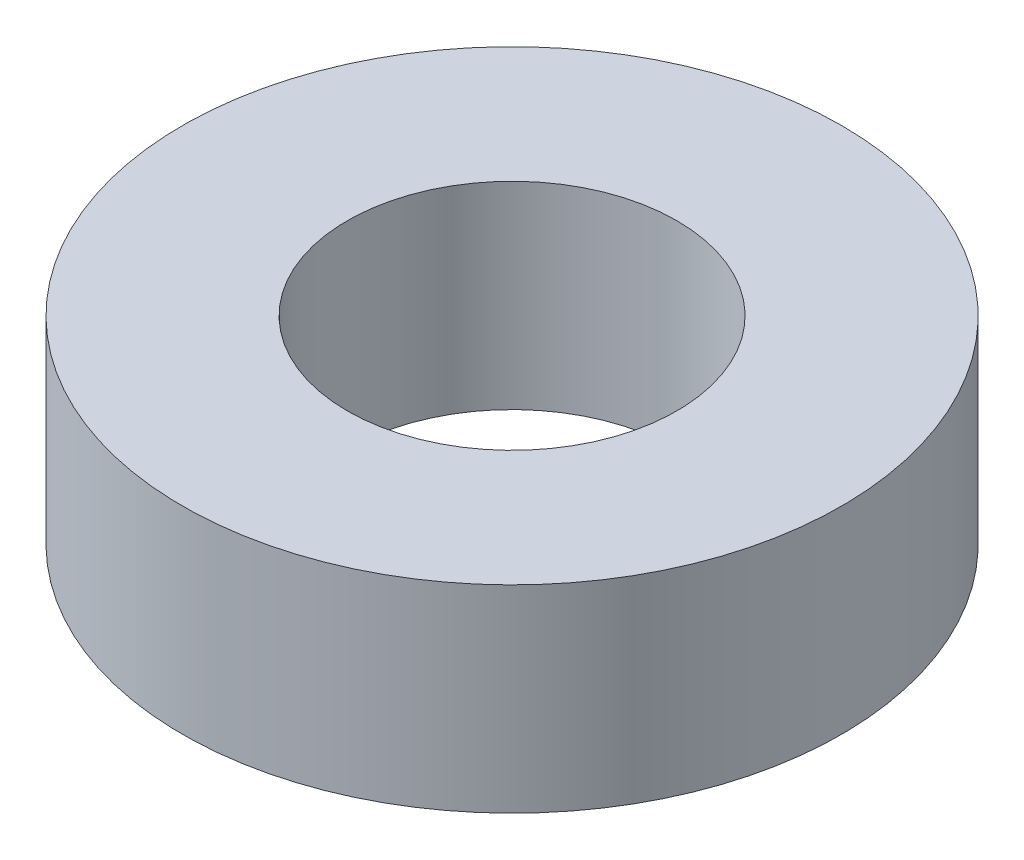
ISO-10303-21;
HEADER;
FILE_DESCRIPTION(('STEP AP214'),'2;1');
FILE_NAME('part.step','',(''),(''),'','','');
FILE_SCHEMA(('AUTOMOTIVE_DESIGN { 1 0 10303 214 1 1 1 1 }'));
ENDSEC;
DATA;
#1=APPLICATION_CONTEXT('core data for automotive mechanical design processes');
#2=APPLICATION_PROTOCOL_DEFINITION('international standard','automotive_design',2000,#1);
#3=PRODUCT_CONTEXT('',#1,'mechanical');
#4=PRODUCT('Part','Part','',(#3));
#5=PRODUCT_RELATED_PRODUCT_CATEGORY('part','',(#4));
#6=PRODUCT_DEFINITION_FORMATION('','',#4);
#7=PRODUCT_DEFINITION_CONTEXT('part definition',#1,'design');
#8=PRODUCT_DEFINITION('design','',#6,#7);
#9=PRODUCT_DEFINITION_SHAPE('','',#8);
#10=(LENGTH_UNIT() NAMED_UNIT(*) SI_UNIT(.MILLI.,.METRE.));
#11=(NAMED_UNIT(*) PLANE_ANGLE_UNIT() SI_UNIT($,.RADIAN.));
#12=(NAMED_UNIT(*) SI_UNIT($,.STERADIAN.) SOLID_ANGLE_UNIT());
#13=UNCERTAINTY_MEASURE_WITH_UNIT(LENGTH_MEASURE(1.E-05),#10,'distance_accuracy_value','');
#14=(GEOMETRIC_REPRESENTATION_CONTEXT(3) GLOBAL_UNCERTAINTY_ASSIGNED_CONTEXT((#13)) GLOBAL_UNIT_ASSIGNED_CONTEXT((#10,
#11,#12)) REPRESENTATION_CONTEXT('',''));
#15=CARTESIAN_POINT('',(0.,0.,0.));
#16=DIRECTION('',(0.,0.,1.));
#17=DIRECTION('',(1.,0.,0.));
#18=AXIS2_PLACEMENT_3D('',#15,#16,#17);
#19=CARTESIAN_POINT('',(0.,1.905,0.));
#20=DIRECTION('',(0.,1.,0.));
#21=DIRECTION('',(0.,0.,1.));
#22=AXIS2_PLACEMENT_3D('',#19,#20,#21);
#23=PLANE('',#22);
#24=CARTESIAN_POINT('',(0.,1.905,0.));
#25=DIRECTION('',(0.,1.,0.));
#26=DIRECTION('',(0.,0.,1.));
#27=AXIS2_PLACEMENT_3D('',#24,#25,#26);
#28=CIRCLE('',#27,3.175);
#29=CARTESIAN_POINT('',(0.,1.905,-3.175));
#30=VERTEX_POINT('',#29);
#31=EDGE_CURVE('E10',#30,#30,#28,.T.);
#32=ORIENTED_EDGE('',*,*,#31,.T.);
#33=EDGE_LOOP('',(#32));
#34=FACE_BOUND('',#33,.T.);
#35=CARTESIAN_POINT('',(0.,1.905,0.));
#36=DIRECTION('',(0.,1.,0.));
#37=DIRECTION('',(0.,0.,1.));
#38=AXIS2_PLACEMENT_3D('',#35,#36,#37);
#39=CIRCLE('',#38,1.5875);
#40=CARTESIAN_POINT('',(0.,1.905,-1.5875));
#41=VERTEX_POINT('',#40);
#42=EDGE_CURVE('E46',#41,#41,#39,.T.);
#43=ORIENTED_EDGE('',*,*,#42,.F.);
#44=EDGE_LOOP('',(#43));
#45=FACE_BOUND('',#44,.T.);
#46=ADVANCED_FACE('F35',(#34,#45),#23,.T.);
#47=CARTESIAN_POINT('',(0.,0.,0.));
#48=DIRECTION('',(0.,1.,0.));
#49=DIRECTION('',(0.,0.,1.));
#50=AXIS2_PLACEMENT_3D('',#47,#48,#49);
#51=PLANE('',#50);
#52=CARTESIAN_POINT('',(0.,0.,0.));
#53=DIRECTION('',(0.,1.,0.));
#54=DIRECTION('',(0.,0.,1.));
#55=AXIS2_PLACEMENT_3D('',#52,#53,#54);
#56=CIRCLE('',#55,3.175);
#57=CARTESIAN_POINT('',(0.,0.,-3.175));
#58=VERTEX_POINT('',#57);
#59=EDGE_CURVE('E39',#58,#58,#56,.T.);
#60=ORIENTED_EDGE('',*,*,#59,.F.);
#61=EDGE_LOOP('',(#60));
#62=FACE_BOUND('',#61,.T.);
#63=CARTESIAN_POINT('',(0.,0.,0.));
#64=DIRECTION('',(0.,1.,0.));
#65=DIRECTION('',(0.,0.,1.));
#66=AXIS2_PLACEMENT_3D('',#63,#64,#65);
#67=CIRCLE('',#66,1.5875);
#68=CARTESIAN_POINT('',(0.,0.,-1.5875));
#69=VERTEX_POINT('',#68);
#70=EDGE_CURVE('E48',#69,#69,#67,.T.);
#71=ORIENTED_EDGE('',*,*,#70,.T.);
#72=EDGE_LOOP('',(#71));
#73=FACE_BOUND('',#72,.T.);
#74=ADVANCED_FACE('F58',(#62,#73),#51,.F.);
#75=CARTESIAN_POINT('',(0.,1.905,0.));
#76=DIRECTION('',(0.,-1.,0.));
#77=DIRECTION('',(0.,0.,-1.));
#78=AXIS2_PLACEMENT_3D('',#75,#76,#77);
#79=CYLINDRICAL_SURFACE('',#78,3.175);
#80=CARTESIAN_POINT('',(0.,1.905,-3.175));
#81=CARTESIAN_POINT('',(0.,1.88515625,-3.175));
#82=CARTESIAN_POINT('',(0.,1.8653125,-3.175));
#83=CARTESIAN_POINT('',(0.,1.825625,-3.175));
#84=CARTESIAN_POINT('',(0.,1.80578125,-3.175));
#85=CARTESIAN_POINT('',(0.,1.76609375,-3.175));
#86=CARTESIAN_POINT('',(0.,1.74625,-3.175));
#87=CARTESIAN_POINT('',(0.,1.7065625,-3.175));
#88=CARTESIAN_POINT('',(0.,1.68671875,-3.175));
#89=CARTESIAN_POINT('',(0.,1.64703125,-3.175));
#90=CARTESIAN_POINT('',(0.,1.6271875,-3.175));
#91=CARTESIAN_POINT('',(0.,1.5875,-3.175));
#92=CARTESIAN_POINT('',(0.,1.56765625,-3.175));
#93=CARTESIAN_POINT('',(0.,1.52796875,-3.175));
#94=CARTESIAN_POINT('',(0.,1.508125,-3.175));
#95=CARTESIAN_POINT('',(0.,1.4684375,-3.175));
#96=CARTESIAN_POINT('',(0.,1.44859375,-3.175));
#97=CARTESIAN_POINT('',(0.,1.40890625,-3.175));
#98=CARTESIAN_POINT('',(0.,1.3890625,-3.175));
#99=CARTESIAN_POINT('',(0.,1.349375,-3.175));
#100=CARTESIAN_POINT('',(0.,1.32953125,-3.175));
#101=CARTESIAN_POINT('',(0.,1.28984375,-3.175));
#102=CARTESIAN_POINT('',(0.,1.27,-3.175));
#103=CARTESIAN_POINT('',(0.,1.2303125,-3.175));
#104=CARTESIAN_POINT('',(0.,1.21046875,-3.175));
#105=CARTESIAN_POINT('',(0.,1.17078125,-3.175));
#106=CARTESIAN_POINT('',(0.,1.1509375,-3.175));
#107=CARTESIAN_POINT('',(0.,1.11125,-3.175));
#108=CARTESIAN_POINT('',(0.,1.09140625,-3.175));
#109=CARTESIAN_POINT('',(0.,1.05171875,-3.175));
#110=CARTESIAN_POINT('',(0.,1.031875,-3.175));
#111=CARTESIAN_POINT('',(0.,0.9921875,-3.175));
#112=CARTESIAN_POINT('',(0.,0.97234375,-3.175));
#113=CARTESIAN_POINT('',(0.,0.93265625,-3.175));
#114=CARTESIAN_POINT('',(0.,0.9128125,-3.175));
#115=CARTESIAN_POINT('',(0.,0.873125,-3.175));
#116=CARTESIAN_POINT('',(0.,0.85328125,-3.175));
#117=CARTESIAN_POINT('',(0.,0.81359375,-3.175));
#118=CARTESIAN_POINT('',(0.,0.79375,-3.175));
#119=CARTESIAN_POINT('',(0.,0.7540625,-3.175));
#120=CARTESIAN_POINT('',(0.,0.73421875,-3.175));
#121=CARTESIAN_POINT('',(0.,0.69453125,-3.175));
#122=CARTESIAN_POINT('',(0.,0.6746875,-3.175));
#123=CARTESIAN_POINT('',(0.,0.635,-3.175));
#124=CARTESIAN_POINT('',(0.,0.61515625,-3.175));
#125=CARTESIAN_POINT('',(0.,0.57546875,-3.175));
#126=CARTESIAN_POINT('',(0.,0.555625,-3.175));
#127=CARTESIAN_POINT('',(0.,0.5159375,-3.175));
#128=CARTESIAN_POINT('',(0.,0.49609375,-3.175));
#129=CARTESIAN_POINT('',(0.,0.45640625,-3.175));
#130=CARTESIAN_POINT('',(0.,0.4365625,-3.175));
#131=CARTESIAN_POINT('',(0.,0.396875,-3.175));
#132=CARTESIAN_POINT('',(0.,0.37703125,-3.175));
#133=CARTESIAN_POINT('',(0.,0.33734375,-3.175));
#134=CARTESIAN_POINT('',(0.,0.3175,-3.175));
#135=CARTESIAN_POINT('',(0.,0.2778125,-3.175));
#136=CARTESIAN_POINT('',(0.,0.25796875,-3.175));
#137=CARTESIAN_POINT('',(0.,0.21828125,-3.175));
#138=CARTESIAN_POINT('',(0.,0.1984375,-3.175));
#139=CARTESIAN_POINT('',(0.,0.15875,-3.175));
#140=CARTESIAN_POINT('',(0.,0.13890625,-3.175));
#141=CARTESIAN_POINT('',(0.,0.09921875,-3.175));
#142=CARTESIAN_POINT('',(0.,0.0793749999999999,-3.175));
#143=CARTESIAN_POINT('',(0.,0.0396874999999999,-3.175));
#144=CARTESIAN_POINT('',(0.,0.01984375,-3.175));
#145=CARTESIAN_POINT('',(0.,0.,-3.175));
#146=B_SPLINE_CURVE_WITH_KNOTS('',3,(#80,#81,#82,#83,#84,#85,#86,#87,#88,#89,#90,#91,#92,#93,
#94,#95,#96,#97,#98,#99,#100,#101,#102,#103,#104,#105,#106,#107,#108,#109,#110,#111,#112,#113,
#114,#115,#116,#117,#118,#119,#120,#121,#122,#123,#124,#125,#126,#127,#128,#129,#130,#131,#132,
#133,#134,#135,#136,#137,#138,#139,#140,#141,#142,#143,#144,#145),.UNSPECIFIED.,.F.,.F.,(4,2,2,
2,2,2,2,2,2,2,2,2,2,2,2,2,2,2,2,2,2,2,2,2,2,2,2,2,2,2,2,2,4),(0.,0.0595312500000001,0.1190625,
0.17859375,0.238125,0.29765625,0.3571875,0.41671875,0.47625,0.53578125,0.5953125,0.65484375,
0.714375,0.77390625,0.8334375,0.89296875,0.9525,1.01203125,1.0715625,1.13109375,1.190625,
1.25015625,1.3096875,1.36921875,1.42875,1.48828125,1.5478125,1.60734375,1.666875,1.72640625,
1.7859375,1.84546875,1.905),.UNSPECIFIED.);
#147=EDGE_CURVE('BSEAM37',#30,#58,#146,.T.);
#148=ORIENTED_EDGE('',*,*,#31,.F.);
#149=ORIENTED_EDGE('',*,*,#59,.T.);
#150=ORIENTED_EDGE('',*,*,#147,.T.);
#151=ORIENTED_EDGE('',*,*,#147,.F.);
#152=EDGE_LOOP('',(#148,#150,#149,#151));
#153=FACE_BOUND('',#152,.T.);
#154=ADVANCED_FACE('F37',(#153),#79,.T.);
#155=CARTESIAN_POINT('',(0.,1.905,0.));
#156=DIRECTION('',(0.,-1.,0.));
#157=DIRECTION('',(0.,0.,-1.));
#158=AXIS2_PLACEMENT_3D('',#155,#156,#157);
#159=CYLINDRICAL_SURFACE('',#158,1.5875);
#160=CARTESIAN_POINT('',(0.,1.905,-1.5875));
#161=CARTESIAN_POINT('',(0.,1.88515625,-1.5875));
#162=CARTESIAN_POINT('',(0.,1.8653125,-1.5875));
#163=CARTESIAN_POINT('',(0.,1.825625,-1.5875));
#164=CARTESIAN_POINT('',(0.,1.80578125,-1.5875));
#165=CARTESIAN_POINT('',(0.,1.76609375,-1.5875));
#166=CARTESIAN_POINT('',(0.,1.74625,-1.5875));
#167=CARTESIAN_POINT('',(0.,1.7065625,-1.5875));
#168=CARTESIAN_POINT('',(0.,1.68671875,-1.5875));
#169=CARTESIAN_POINT('',(0.,1.64703125,-1.5875));
#170=CARTESIAN_POINT('',(0.,1.6271875,-1.5875));
#171=CARTESIAN_POINT('',(0.,1.5875,-1.5875));
#172=CARTESIAN_POINT('',(0.,1.56765625,-1.5875));
#173=CARTESIAN_POINT('',(0.,1.52796875,-1.5875));
#174=CARTESIAN_POINT('',(0.,1.508125,-1.5875));
#175=CARTESIAN_POINT('',(0.,1.4684375,-1.5875));
#176=CARTESIAN_POINT('',(0.,1.44859375,-1.5875));
#177=CARTESIAN_POINT('',(0.,1.40890625,-1.5875));
#178=CARTESIAN_POINT('',(0.,1.3890625,-1.5875));
#179=CARTESIAN_POINT('',(0.,1.349375,-1.5875));
#180=CARTESIAN_POINT('',(0.,1.32953125,-1.5875));
#181=CARTESIAN_POINT('',(0.,1.28984375,-1.5875));
#182=CARTESIAN_POINT('',(0.,1.27,-1.5875));
#183=CARTESIAN_POINT('',(0.,1.2303125,-1.5875));
#184=CARTESIAN_POINT('',(0.,1.21046875,-1.5875));
#185=CARTESIAN_POINT('',(0.,1.17078125,-1.5875));
#186=CARTESIAN_POINT('',(0.,1.1509375,-1.5875));
#187=CARTESIAN_POINT('',(0.,1.11125,-1.5875));
#188=CARTESIAN_POINT('',(0.,1.09140625,-1.5875));
#189=CARTESIAN_POINT('',(0.,1.05171875,-1.5875));
#190=CARTESIAN_POINT('',(0.,1.031875,-1.5875));
#191=CARTESIAN_POINT('',(0.,0.9921875,-1.5875));
#192=CARTESIAN_POINT('',(0.,0.97234375,-1.5875));
#193=CARTESIAN_POINT('',(0.,0.93265625,-1.5875));
#194=CARTESIAN_POINT('',(0.,0.9128125,-1.5875));
#195=CARTESIAN_POINT('',(0.,0.873125,-1.5875));
#196=CARTESIAN_POINT('',(0.,0.85328125,-1.5875));
#197=CARTESIAN_POINT('',(0.,0.81359375,-1.5875));
#198=CARTESIAN_POINT('',(0.,0.79375,-1.5875));
#199=CARTESIAN_POINT('',(0.,0.7540625,-1.5875));
#200=CARTESIAN_POINT('',(0.,0.73421875,-1.5875));
#201=CARTESIAN_POINT('',(0.,0.69453125,-1.5875));
#202=CARTESIAN_POINT('',(0.,0.6746875,-1.5875));
#203=CARTESIAN_POINT('',(0.,0.635,-1.5875));
#204=CARTESIAN_POINT('',(0.,0.61515625,-1.5875));
#205=CARTESIAN_POINT('',(0.,0.57546875,-1.5875));
#206=CARTESIAN_POINT('',(0.,0.555625,-1.5875));
#207=CARTESIAN_POINT('',(0.,0.5159375,-1.5875));
#208=CARTESIAN_POINT('',(0.,0.49609375,-1.5875));
#209=CARTESIAN_POINT('',(0.,0.45640625,-1.5875));
#210=CARTESIAN_POINT('',(0.,0.4365625,-1.5875));
#211=CARTESIAN_POINT('',(0.,0.396875,-1.5875));
#212=CARTESIAN_POINT('',(0.,0.37703125,-1.5875));
#213=CARTESIAN_POINT('',(0.,0.33734375,-1.5875));
#214=CARTESIAN_POINT('',(0.,0.3175,-1.5875));
#215=CARTESIAN_POINT('',(0.,0.2778125,-1.5875));
#216=CARTESIAN_POINT('',(0.,0.25796875,-1.5875));
#217=CARTESIAN_POINT('',(0.,0.21828125,-1.5875));
#218=CARTESIAN_POINT('',(0.,0.1984375,-1.5875));
#219=CARTESIAN_POINT('',(0.,0.15875,-1.5875));
#220=CARTESIAN_POINT('',(0.,0.13890625,-1.5875));
#221=CARTESIAN_POINT('',(0.,0.09921875,-1.5875));
#222=CARTESIAN_POINT('',(0.,0.0793749999999999,-1.5875));
#223=CARTESIAN_POINT('',(0.,0.0396874999999999,-1.5875));
#224=CARTESIAN_POINT('',(0.,0.01984375,-1.5875));
#225=CARTESIAN_POINT('',(0.,0.,-1.5875));
#226=B_SPLINE_CURVE_WITH_KNOTS('',3,(#160,#161,#162,#163,#164,#165,#166,#167,#168,#169,#170,
#171,#172,#173,#174,#175,#176,#177,#178,#179,#180,#181,#182,#183,#184,#185,#186,#187,#188,#189,
#190,#191,#192,#193,#194,#195,#196,#197,#198,#199,#200,#201,#202,#203,#204,#205,#206,#207,#208,
#209,#210,#211,#212,#213,#214,#215,#216,#217,#218,#219,#220,#221,#222,#223,#224,#225),
.UNSPECIFIED.,.F.,.F.,(4,2,2,2,2,2,2,2,2,2,2,2,2,2,2,2,2,2,2,2,2,2,2,2,2,2,2,2,2,2,2,2,4),(0.,
0.0595312499999999,0.1190625,0.17859375,0.238125,0.29765625,0.3571875,0.41671875,0.47625,
0.53578125,0.5953125,0.65484375,0.714375,0.77390625,0.833437499999999,0.89296875,0.9525,
1.01203125,1.0715625,1.13109375,1.190625,1.25015625,1.3096875,1.36921875,1.42875,1.48828125,
1.5478125,1.60734375,1.666875,1.72640625,1.7859375,1.84546875,1.905),.UNSPECIFIED.);
#227=EDGE_CURVE('BSEAM54',#41,#69,#226,.T.);
#228=ORIENTED_EDGE('',*,*,#42,.T.);
#229=ORIENTED_EDGE('',*,*,#70,.F.);
#230=ORIENTED_EDGE('',*,*,#227,.T.);
#231=ORIENTED_EDGE('',*,*,#227,.F.);
#232=EDGE_LOOP('',(#228,#230,#229,#231));
#233=FACE_BOUND('',#232,.T.);
#234=ADVANCED_FACE('F54',(#233),#159,.F.);
#235=CLOSED_SHELL('',(#46,#74,#154,#234));
#236=MANIFOLD_SOLID_BREP('B2',#235);
#237=ADVANCED_BREP_SHAPE_REPRESENTATION('',(#18,#236),#14);
#238=SHAPE_DEFINITION_REPRESENTATION(#9,#237);
ENDSEC;
END-ISO-10303-21;
